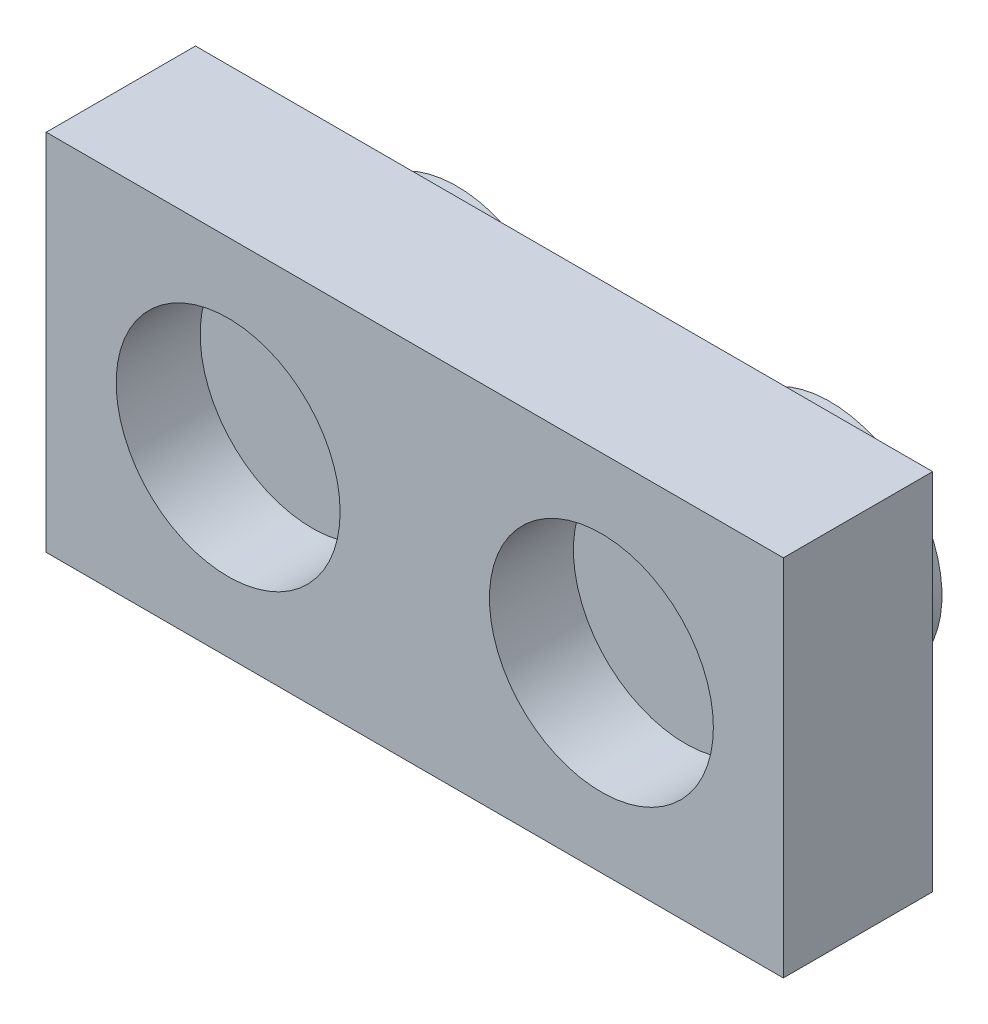
ISO-10303-21;
HEADER;
FILE_DESCRIPTION(('STEP AP214'),'2;1');
FILE_NAME('part.step','',(''),(''),'','','');
FILE_SCHEMA(('AUTOMOTIVE_DESIGN { 1 0 10303 214 1 1 1 1 }'));
ENDSEC;
DATA;
#1=APPLICATION_CONTEXT('core data for automotive mechanical design processes');
#2=APPLICATION_PROTOCOL_DEFINITION('international standard','automotive_design',2000,#1);
#3=PRODUCT_CONTEXT('',#1,'mechanical');
#4=PRODUCT('Part','Part','',(#3));
#5=PRODUCT_RELATED_PRODUCT_CATEGORY('part','',(#4));
#6=PRODUCT_DEFINITION_FORMATION('','',#4);
#7=PRODUCT_DEFINITION_CONTEXT('part definition',#1,'design');
#8=PRODUCT_DEFINITION('design','',#6,#7);
#9=PRODUCT_DEFINITION_SHAPE('','',#8);
#10=(LENGTH_UNIT() NAMED_UNIT(*) SI_UNIT(.MILLI.,.METRE.));
#11=(NAMED_UNIT(*) PLANE_ANGLE_UNIT() SI_UNIT($,.RADIAN.));
#12=(NAMED_UNIT(*) SI_UNIT($,.STERADIAN.) SOLID_ANGLE_UNIT());
#13=UNCERTAINTY_MEASURE_WITH_UNIT(LENGTH_MEASURE(1.E-05),#10,'distance_accuracy_value','');
#14=(GEOMETRIC_REPRESENTATION_CONTEXT(3) GLOBAL_UNCERTAINTY_ASSIGNED_CONTEXT((#13)) GLOBAL_UNIT_ASSIGNED_CONTEXT((#10,
#11,#12)) REPRESENTATION_CONTEXT('',''));
#15=CARTESIAN_POINT('',(0.,0.,0.));
#16=DIRECTION('',(0.,0.,1.));
#17=DIRECTION('',(1.,0.,0.));
#18=AXIS2_PLACEMENT_3D('',#15,#16,#17);
#19=CARTESIAN_POINT('',(0.,0.,0.));
#20=DIRECTION('',(0.,0.,-1.));
#21=DIRECTION('',(-1.,0.,0.));
#22=AXIS2_PLACEMENT_3D('',#19,#20,#21);
#23=PLANE('',#22);
#24=CARTESIAN_POINT('',(4.,0.,0.));
#25=DIRECTION('',(0.,0.,-1.));
#26=DIRECTION('',(-1.,0.,0.));
#27=AXIS2_PLACEMENT_3D('',#24,#25,#26);
#28=CIRCLE('',#27,2.4);
#29=CARTESIAN_POINT('',(1.6,0.,0.));
#30=VERTEX_POINT('',#29);
#31=EDGE_CURVE('E113',#30,#30,#28,.T.);
#32=ORIENTED_EDGE('',*,*,#31,.F.);
#33=EDGE_LOOP('',(#32));
#34=FACE_BOUND('',#33,.T.);
#35=DIRECTION('',(0.,1.,0.));
#36=VECTOR('',#35,1.);
#37=CARTESIAN_POINT('',(7.9,-3.9,0.));
#38=LINE('',#37,#36);
#39=CARTESIAN_POINT('',(7.9,-3.9,0.));
#40=VERTEX_POINT('',#39);
#41=CARTESIAN_POINT('',(7.9,3.9,0.));
#42=VERTEX_POINT('',#41);
#43=EDGE_CURVE('E99',#40,#42,#38,.T.);
#44=ORIENTED_EDGE('',*,*,#43,.F.);
#45=DIRECTION('',(1.,0.,0.));
#46=VECTOR('',#45,1.);
#47=CARTESIAN_POINT('',(-7.9,-3.9,0.));
#48=LINE('',#47,#46);
#49=CARTESIAN_POINT('',(-7.9,-3.9,0.));
#50=VERTEX_POINT('',#49);
#51=EDGE_CURVE('E75',#50,#40,#48,.T.);
#52=ORIENTED_EDGE('',*,*,#51,.F.);
#53=DIRECTION('',(0.,-1.,0.));
#54=VECTOR('',#53,1.);
#55=CARTESIAN_POINT('',(-7.9,-3.9,0.));
#56=LINE('',#55,#54);
#57=CARTESIAN_POINT('',(-7.9,3.9,0.));
#58=VERTEX_POINT('',#57);
#59=EDGE_CURVE('E69',#58,#50,#56,.T.);
#60=ORIENTED_EDGE('',*,*,#59,.F.);
#61=DIRECTION('',(-1.,0.,0.));
#62=VECTOR('',#61,1.);
#63=CARTESIAN_POINT('',(-7.9,3.9,0.));
#64=LINE('',#63,#62);
#65=EDGE_CURVE('E91',#42,#58,#64,.T.);
#66=ORIENTED_EDGE('',*,*,#65,.F.);
#67=EDGE_LOOP('',(#44,#52,#60,#66));
#68=FACE_BOUND('',#67,.T.);
#69=CARTESIAN_POINT('',(-4.,0.,0.));
#70=DIRECTION('',(0.,0.,-1.));
#71=DIRECTION('',(-1.,0.,0.));
#72=AXIS2_PLACEMENT_3D('',#69,#70,#71);
#73=CIRCLE('',#72,2.4);
#74=CARTESIAN_POINT('',(-6.4,0.,0.));
#75=VERTEX_POINT('',#74);
#76=EDGE_CURVE('E119',#75,#75,#73,.T.);
#77=ORIENTED_EDGE('',*,*,#76,.F.);
#78=EDGE_LOOP('',(#77));
#79=FACE_BOUND('',#78,.T.);
#80=ADVANCED_FACE('F35',(#34,#68,#79),#23,.T.);
#81=CARTESIAN_POINT('',(7.9,-3.9,3.2));
#82=DIRECTION('',(-1.,0.,0.));
#83=DIRECTION('',(0.,0.,1.));
#84=AXIS2_PLACEMENT_3D('',#81,#82,#83);
#85=PLANE('',#84);
#86=ORIENTED_EDGE('',*,*,#43,.T.);
#87=DIRECTION('',(0.,0.,-1.));
#88=VECTOR('',#87,1.);
#89=CARTESIAN_POINT('',(7.9,3.9,3.2));
#90=LINE('',#89,#88);
#91=CARTESIAN_POINT('',(7.9,3.9,3.2));
#92=VERTEX_POINT('',#91);
#93=EDGE_CURVE('E11',#92,#42,#90,.T.);
#94=ORIENTED_EDGE('',*,*,#93,.F.);
#95=DIRECTION('',(0.,1.,0.));
#96=VECTOR('',#95,1.);
#97=CARTESIAN_POINT('',(7.9,-3.9,3.2));
#98=LINE('',#97,#96);
#99=CARTESIAN_POINT('',(7.9,-3.9,3.2));
#100=VERTEX_POINT('',#99);
#101=EDGE_CURVE('E87',#100,#92,#98,.T.);
#102=ORIENTED_EDGE('',*,*,#101,.F.);
#103=DIRECTION('',(0.,0.,-1.));
#104=VECTOR('',#103,1.);
#105=CARTESIAN_POINT('',(7.9,-3.9,3.2));
#106=LINE('',#105,#104);
#107=EDGE_CURVE('E95',#100,#40,#106,.T.);
#108=ORIENTED_EDGE('',*,*,#107,.T.);
#109=EDGE_LOOP('',(#86,#94,#102,#108));
#110=FACE_BOUND('',#109,.T.);
#111=ADVANCED_FACE('F37',(#110),#85,.F.);
#112=CARTESIAN_POINT('',(-7.9,3.9,3.2));
#113=DIRECTION('',(0.,-1.,0.));
#114=DIRECTION('',(0.,0.,-1.));
#115=AXIS2_PLACEMENT_3D('',#112,#113,#114);
#116=PLANE('',#115);
#117=ORIENTED_EDGE('',*,*,#65,.T.);
#118=DIRECTION('',(0.,0.,-1.));
#119=VECTOR('',#118,1.);
#120=CARTESIAN_POINT('',(-7.9,3.9,3.2));
#121=LINE('',#120,#119);
#122=CARTESIAN_POINT('',(-7.9,3.9,3.2));
#123=VERTEX_POINT('',#122);
#124=EDGE_CURVE('E44',#123,#58,#121,.T.);
#125=ORIENTED_EDGE('',*,*,#124,.F.);
#126=DIRECTION('',(-1.,0.,0.));
#127=VECTOR('',#126,1.);
#128=CARTESIAN_POINT('',(-7.9,3.9,3.2));
#129=LINE('',#128,#127);
#130=EDGE_CURVE('E82',#92,#123,#129,.T.);
#131=ORIENTED_EDGE('',*,*,#130,.F.);
#132=ORIENTED_EDGE('',*,*,#93,.T.);
#133=EDGE_LOOP('',(#117,#125,#131,#132));
#134=FACE_BOUND('',#133,.T.);
#135=ADVANCED_FACE('F90',(#134),#116,.F.);
#136=CARTESIAN_POINT('',(-7.9,-3.9,3.2));
#137=DIRECTION('',(1.,0.,0.));
#138=DIRECTION('',(0.,0.,-1.));
#139=AXIS2_PLACEMENT_3D('',#136,#137,#138);
#140=PLANE('',#139);
#141=ORIENTED_EDGE('',*,*,#59,.T.);
#142=DIRECTION('',(0.,0.,-1.));
#143=VECTOR('',#142,1.);
#144=CARTESIAN_POINT('',(-7.9,-3.9,3.2));
#145=LINE('',#144,#143);
#146=CARTESIAN_POINT('',(-7.9,-3.9,3.2));
#147=VERTEX_POINT('',#146);
#148=EDGE_CURVE('E92',#147,#50,#145,.T.);
#149=ORIENTED_EDGE('',*,*,#148,.F.);
#150=DIRECTION('',(0.,-1.,0.));
#151=VECTOR('',#150,1.);
#152=CARTESIAN_POINT('',(-7.9,-3.9,3.2));
#153=LINE('',#152,#151);
#154=EDGE_CURVE('E85',#123,#147,#153,.T.);
#155=ORIENTED_EDGE('',*,*,#154,.F.);
#156=ORIENTED_EDGE('',*,*,#124,.T.);
#157=EDGE_LOOP('',(#141,#149,#155,#156));
#158=FACE_BOUND('',#157,.T.);
#159=ADVANCED_FACE('F93',(#158),#140,.F.);
#160=CARTESIAN_POINT('',(-7.9,-3.9,3.2));
#161=DIRECTION('',(0.,1.,0.));
#162=DIRECTION('',(0.,0.,1.));
#163=AXIS2_PLACEMENT_3D('',#160,#161,#162);
#164=PLANE('',#163);
#165=ORIENTED_EDGE('',*,*,#51,.T.);
#166=ORIENTED_EDGE('',*,*,#107,.F.);
#167=DIRECTION('',(1.,0.,0.));
#168=VECTOR('',#167,1.);
#169=CARTESIAN_POINT('',(-7.9,-3.9,3.2));
#170=LINE('',#169,#168);
#171=EDGE_CURVE('E52',#147,#100,#170,.T.);
#172=ORIENTED_EDGE('',*,*,#171,.F.);
#173=ORIENTED_EDGE('',*,*,#148,.T.);
#174=EDGE_LOOP('',(#165,#166,#172,#173));
#175=FACE_BOUND('',#174,.T.);
#176=ADVANCED_FACE('F107',(#175),#164,.F.);
#177=CARTESIAN_POINT('',(0.,0.,3.2));
#178=DIRECTION('',(0.,0.,-1.));
#179=DIRECTION('',(-1.,0.,0.));
#180=AXIS2_PLACEMENT_3D('',#177,#178,#179);
#181=PLANE('',#180);
#182=CARTESIAN_POINT('',(4.,0.,3.2));
#183=DIRECTION('',(0.,0.,1.));
#184=DIRECTION('',(1.,0.,0.));
#185=AXIS2_PLACEMENT_3D('',#182,#183,#184);
#186=CIRCLE('',#185,2.4);
#187=CARTESIAN_POINT('',(6.4,0.,3.2));
#188=VERTEX_POINT('',#187);
#189=EDGE_CURVE('E131',#188,#188,#186,.T.);
#190=ORIENTED_EDGE('',*,*,#189,.F.);
#191=EDGE_LOOP('',(#190));
#192=FACE_BOUND('',#191,.T.);
#193=CARTESIAN_POINT('',(-4.,0.,3.2));
#194=DIRECTION('',(0.,0.,1.));
#195=DIRECTION('',(1.,0.,0.));
#196=AXIS2_PLACEMENT_3D('',#193,#194,#195);
#197=CIRCLE('',#196,2.4);
#198=CARTESIAN_POINT('',(-1.6,0.,3.2));
#199=VERTEX_POINT('',#198);
#200=EDGE_CURVE('E125',#199,#199,#197,.T.);
#201=ORIENTED_EDGE('',*,*,#200,.F.);
#202=EDGE_LOOP('',(#201));
#203=FACE_BOUND('',#202,.T.);
#204=ORIENTED_EDGE('',*,*,#101,.T.);
#205=ORIENTED_EDGE('',*,*,#130,.T.);
#206=ORIENTED_EDGE('',*,*,#154,.T.);
#207=ORIENTED_EDGE('',*,*,#171,.T.);
#208=EDGE_LOOP('',(#204,#205,#206,#207));
#209=FACE_BOUND('',#208,.T.);
#210=ADVANCED_FACE('F83',(#192,#203,#209),#181,.F.);
#211=CARTESIAN_POINT('',(4.,0.,-1.7));
#212=DIRECTION('',(0.,0.,1.));
#213=DIRECTION('',(1.,0.,0.));
#214=AXIS2_PLACEMENT_3D('',#211,#212,#213);
#215=CYLINDRICAL_SURFACE('',#214,2.4);
#216=CARTESIAN_POINT('',(4.,0.,-1.7));
#217=DIRECTION('',(0.,0.,-1.));
#218=DIRECTION('',(-1.,0.,0.));
#219=AXIS2_PLACEMENT_3D('',#216,#217,#218);
#220=CIRCLE('',#219,2.4);
#221=CARTESIAN_POINT('',(1.6,0.,-1.7));
#222=VERTEX_POINT('',#221);
#223=EDGE_CURVE('E102',#222,#222,#220,.T.);
#224=ORIENTED_EDGE('',*,*,#223,.F.);
#225=EDGE_LOOP('',(#224));
#226=FACE_BOUND('',#225,.T.);
#227=ORIENTED_EDGE('',*,*,#31,.T.);
#228=EDGE_LOOP('',(#227));
#229=FACE_BOUND('',#228,.T.);
#230=ADVANCED_FACE('F148',(#226,#229),#215,.T.);
#231=CARTESIAN_POINT('',(4.,0.,-1.7));
#232=DIRECTION('',(0.,0.,-1.));
#233=DIRECTION('',(-1.,0.,0.));
#234=AXIS2_PLACEMENT_3D('',#231,#232,#233);
#235=PLANE('',#234);
#236=ORIENTED_EDGE('',*,*,#223,.T.);
#237=EDGE_LOOP('',(#236));
#238=FACE_BOUND('',#237,.T.);
#239=ADVANCED_FACE('F203',(#238),#235,.T.);
#240=CARTESIAN_POINT('',(-4.,0.,-1.7));
#241=DIRECTION('',(0.,0.,1.));
#242=DIRECTION('',(1.,0.,0.));
#243=AXIS2_PLACEMENT_3D('',#240,#241,#242);
#244=CYLINDRICAL_SURFACE('',#243,2.4);
#245=CARTESIAN_POINT('',(-4.,0.,-1.7));
#246=DIRECTION('',(0.,0.,-1.));
#247=DIRECTION('',(-1.,0.,0.));
#248=AXIS2_PLACEMENT_3D('',#245,#246,#247);
#249=CIRCLE('',#248,2.4);
#250=CARTESIAN_POINT('',(-6.4,0.,-1.7));
#251=VERTEX_POINT('',#250);
#252=EDGE_CURVE('E116',#251,#251,#249,.T.);
#253=ORIENTED_EDGE('',*,*,#252,.F.);
#254=EDGE_LOOP('',(#253));
#255=FACE_BOUND('',#254,.T.);
#256=ORIENTED_EDGE('',*,*,#76,.T.);
#257=EDGE_LOOP('',(#256));
#258=FACE_BOUND('',#257,.T.);
#259=ADVANCED_FACE('F163',(#255,#258),#244,.T.);
#260=CARTESIAN_POINT('',(-4.,0.,-1.7));
#261=DIRECTION('',(0.,0.,-1.));
#262=DIRECTION('',(-1.,0.,0.));
#263=AXIS2_PLACEMENT_3D('',#260,#261,#262);
#264=PLANE('',#263);
#265=ORIENTED_EDGE('',*,*,#252,.T.);
#266=EDGE_LOOP('',(#265));
#267=FACE_BOUND('',#266,.T.);
#268=ADVANCED_FACE('F154',(#267),#264,.T.);
#269=CARTESIAN_POINT('',(-4.,0.,1.4));
#270=DIRECTION('',(0.,0.,1.));
#271=DIRECTION('',(1.,0.,0.));
#272=AXIS2_PLACEMENT_3D('',#269,#270,#271);
#273=CYLINDRICAL_SURFACE('',#272,2.4);
#274=CARTESIAN_POINT('',(-4.,0.,1.4));
#275=DIRECTION('',(0.,0.,1.));
#276=DIRECTION('',(1.,0.,0.));
#277=AXIS2_PLACEMENT_3D('',#274,#275,#276);
#278=CIRCLE('',#277,2.4);
#279=CARTESIAN_POINT('',(-1.6,0.,1.4));
#280=VERTEX_POINT('',#279);
#281=EDGE_CURVE('E122',#280,#280,#278,.T.);
#282=ORIENTED_EDGE('',*,*,#281,.F.);
#283=EDGE_LOOP('',(#282));
#284=FACE_BOUND('',#283,.T.);
#285=ORIENTED_EDGE('',*,*,#200,.T.);
#286=EDGE_LOOP('',(#285));
#287=FACE_BOUND('',#286,.T.);
#288=ADVANCED_FACE('F152',(#284,#287),#273,.F.);
#289=CARTESIAN_POINT('',(-4.,0.,1.4));
#290=DIRECTION('',(0.,0.,1.));
#291=DIRECTION('',(1.,0.,0.));
#292=AXIS2_PLACEMENT_3D('',#289,#290,#291);
#293=PLANE('',#292);
#294=ORIENTED_EDGE('',*,*,#281,.T.);
#295=EDGE_LOOP('',(#294));
#296=FACE_BOUND('',#295,.T.);
#297=ADVANCED_FACE('F142',(#296),#293,.T.);
#298=CARTESIAN_POINT('',(4.,0.,1.4));
#299=DIRECTION('',(0.,0.,1.));
#300=DIRECTION('',(1.,0.,0.));
#301=AXIS2_PLACEMENT_3D('',#298,#299,#300);
#302=CYLINDRICAL_SURFACE('',#301,2.4);
#303=CARTESIAN_POINT('',(4.,0.,1.4));
#304=DIRECTION('',(0.,0.,1.));
#305=DIRECTION('',(1.,0.,0.));
#306=AXIS2_PLACEMENT_3D('',#303,#304,#305);
#307=CIRCLE('',#306,2.4);
#308=CARTESIAN_POINT('',(6.4,0.,1.4));
#309=VERTEX_POINT('',#308);
#310=EDGE_CURVE('E128',#309,#309,#307,.T.);
#311=ORIENTED_EDGE('',*,*,#310,.F.);
#312=EDGE_LOOP('',(#311));
#313=FACE_BOUND('',#312,.T.);
#314=ORIENTED_EDGE('',*,*,#189,.T.);
#315=EDGE_LOOP('',(#314));
#316=FACE_BOUND('',#315,.T.);
#317=ADVANCED_FACE('F139',(#313,#316),#302,.F.);
#318=CARTESIAN_POINT('',(4.,0.,1.4));
#319=DIRECTION('',(0.,0.,1.));
#320=DIRECTION('',(1.,0.,0.));
#321=AXIS2_PLACEMENT_3D('',#318,#319,#320);
#322=PLANE('',#321);
#323=ORIENTED_EDGE('',*,*,#310,.T.);
#324=EDGE_LOOP('',(#323));
#325=FACE_BOUND('',#324,.T.);
#326=ADVANCED_FACE('F137',(#325),#322,.T.);
#327=CLOSED_SHELL('',(#80,#111,#135,#159,#176,#210,#230,#239,#259,#268,#288,#297,#317,#326));
#328=MANIFOLD_SOLID_BREP('B2',#327);
#329=ADVANCED_BREP_SHAPE_REPRESENTATION('',(#18,#328),#14);
#330=SHAPE_DEFINITION_REPRESENTATION(#9,#329);
ENDSEC;
END-ISO-10303-21;
